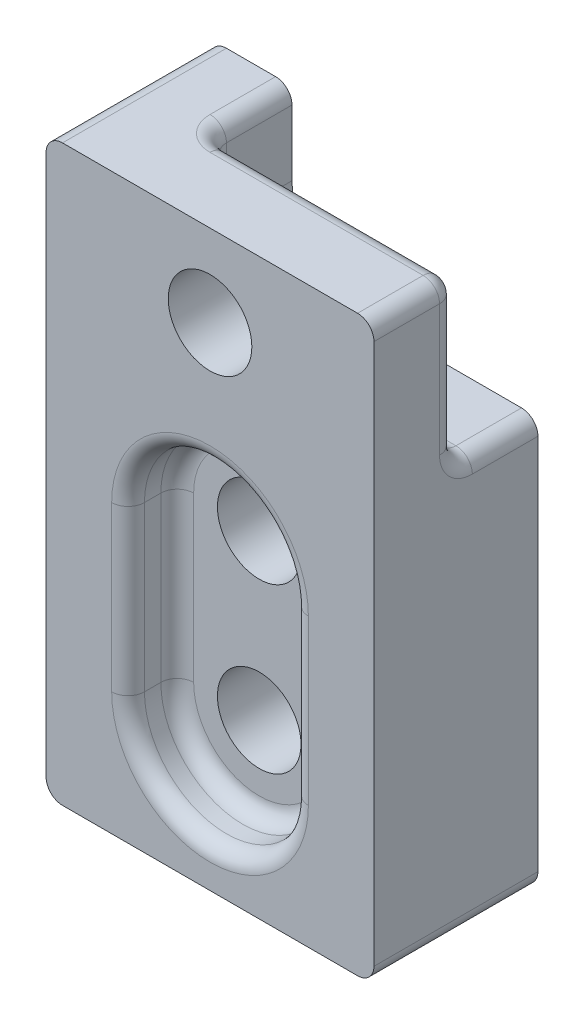
ISO-10303-21;
HEADER;
FILE_DESCRIPTION(('STEP AP214'),'2;1');
FILE_NAME('part.step','',(''),(''),'','','');
FILE_SCHEMA(('AUTOMOTIVE_DESIGN { 1 0 10303 214 1 1 1 1 }'));
ENDSEC;
DATA;
#1=APPLICATION_CONTEXT('core data for automotive mechanical design processes');
#2=APPLICATION_PROTOCOL_DEFINITION('international standard','automotive_design',2000,#1);
#3=PRODUCT_CONTEXT('',#1,'mechanical');
#4=PRODUCT('Part','Part','',(#3));
#5=PRODUCT_RELATED_PRODUCT_CATEGORY('part','',(#4));
#6=PRODUCT_DEFINITION_FORMATION('','',#4);
#7=PRODUCT_DEFINITION_CONTEXT('part definition',#1,'design');
#8=PRODUCT_DEFINITION('design','',#6,#7);
#9=PRODUCT_DEFINITION_SHAPE('','',#8);
#10=(LENGTH_UNIT() NAMED_UNIT(*) SI_UNIT(.MILLI.,.METRE.));
#11=(NAMED_UNIT(*) PLANE_ANGLE_UNIT() SI_UNIT($,.RADIAN.));
#12=(NAMED_UNIT(*) SI_UNIT($,.STERADIAN.) SOLID_ANGLE_UNIT());
#13=UNCERTAINTY_MEASURE_WITH_UNIT(LENGTH_MEASURE(1.E-05),#10,'distance_accuracy_value','');
#14=(GEOMETRIC_REPRESENTATION_CONTEXT(3) GLOBAL_UNCERTAINTY_ASSIGNED_CONTEXT((#13)) GLOBAL_UNIT_ASSIGNED_CONTEXT((#10,
#11,#12)) REPRESENTATION_CONTEXT('',''));
#15=CARTESIAN_POINT('',(0.,0.,0.));
#16=DIRECTION('',(0.,0.,1.));
#17=DIRECTION('',(1.,0.,0.));
#18=AXIS2_PLACEMENT_3D('',#15,#16,#17);
#19=CARTESIAN_POINT('',(0.,0.,10.));
#20=DIRECTION('',(0.,0.,1.));
#21=DIRECTION('',(1.,0.,0.));
#22=AXIS2_PLACEMENT_3D('',#19,#20,#21);
#23=PLANE('',#22);
#24=CARTESIAN_POINT('',(0.,0.,10.));
#25=DIRECTION('',(0.,0.,1.));
#26=DIRECTION('',(1.,0.,0.));
#27=AXIS2_PLACEMENT_3D('',#24,#25,#26);
#28=CIRCLE('',#27,6.);
#29=CARTESIAN_POINT('',(-6.,0.,10.));
#30=VERTEX_POINT('',#29);
#31=CARTESIAN_POINT('',(6.,0.,10.));
#32=VERTEX_POINT('',#31);
#33=EDGE_CURVE('E346',#30,#32,#28,.F.);
#34=ORIENTED_EDGE('',*,*,#33,.T.);
#35=DIRECTION('',(0.,-1.,0.));
#36=VECTOR('',#35,1.);
#37=CARTESIAN_POINT('',(6.,0.,10.));
#38=LINE('',#37,#36);
#39=CARTESIAN_POINT('',(6.,-10.,10.));
#40=VERTEX_POINT('',#39);
#41=EDGE_CURVE('E352',#32,#40,#38,.T.);
#42=ORIENTED_EDGE('',*,*,#41,.T.);
#43=CARTESIAN_POINT('',(0.,-10.,10.));
#44=DIRECTION('',(0.,0.,1.));
#45=DIRECTION('',(1.,0.,0.));
#46=AXIS2_PLACEMENT_3D('',#43,#44,#45);
#47=CIRCLE('',#46,6.);
#48=CARTESIAN_POINT('',(-6.,-10.,10.));
#49=VERTEX_POINT('',#48);
#50=EDGE_CURVE('E350',#40,#49,#47,.F.);
#51=ORIENTED_EDGE('',*,*,#50,.T.);
#52=DIRECTION('',(0.,1.,0.));
#53=VECTOR('',#52,1.);
#54=CARTESIAN_POINT('',(-6.,0.,10.));
#55=LINE('',#54,#53);
#56=EDGE_CURVE('E348',#49,#30,#55,.T.);
#57=ORIENTED_EDGE('',*,*,#56,.T.);
#58=EDGE_LOOP('',(#34,#42,#51,#57));
#59=FACE_BOUND('',#58,.T.);
#60=DIRECTION('',(0.,-1.,0.));
#61=VECTOR('',#60,1.);
#62=CARTESIAN_POINT('',(-10.,-17.5,10.));
#63=LINE('',#62,#61);
#64=CARTESIAN_POINT('',(-10.,16.5,10.));
#65=VERTEX_POINT('',#64);
#66=CARTESIAN_POINT('',(-10.,-16.5,10.));
#67=VERTEX_POINT('',#66);
#68=EDGE_CURVE('E250',#65,#67,#63,.T.);
#69=ORIENTED_EDGE('',*,*,#68,.T.);
#70=CARTESIAN_POINT('',(-9.,-16.5,10.));
#71=DIRECTION('',(0.,0.,1.));
#72=DIRECTION('',(1.,0.,0.));
#73=AXIS2_PLACEMENT_3D('',#70,#71,#72);
#74=CIRCLE('',#73,1.);
#75=CARTESIAN_POINT('',(-9.,-17.5,10.));
#76=VERTEX_POINT('',#75);
#77=EDGE_CURVE('E344',#67,#76,#74,.T.);
#78=ORIENTED_EDGE('',*,*,#77,.T.);
#79=DIRECTION('',(1.,0.,0.));
#80=VECTOR('',#79,1.);
#81=CARTESIAN_POINT('',(-10.,-17.5,10.));
#82=LINE('',#81,#80);
#83=CARTESIAN_POINT('',(9.,-17.5,10.));
#84=VERTEX_POINT('',#83);
#85=EDGE_CURVE('E254',#76,#84,#82,.T.);
#86=ORIENTED_EDGE('',*,*,#85,.T.);
#87=CARTESIAN_POINT('',(9.,-16.5,10.));
#88=DIRECTION('',(0.,0.,1.));
#89=DIRECTION('',(1.,0.,0.));
#90=AXIS2_PLACEMENT_3D('',#87,#88,#89);
#91=CIRCLE('',#90,1.);
#92=CARTESIAN_POINT('',(10.,-16.5,10.));
#93=VERTEX_POINT('',#92);
#94=EDGE_CURVE('E342',#84,#93,#91,.T.);
#95=ORIENTED_EDGE('',*,*,#94,.T.);
#96=DIRECTION('',(0.,1.,0.));
#97=VECTOR('',#96,1.);
#98=CARTESIAN_POINT('',(10.,-17.5,10.));
#99=LINE('',#98,#97);
#100=CARTESIAN_POINT('',(10.,16.5,10.));
#101=VERTEX_POINT('',#100);
#102=EDGE_CURVE('E257',#93,#101,#99,.T.);
#103=ORIENTED_EDGE('',*,*,#102,.T.);
#104=CARTESIAN_POINT('',(9.,16.5,10.));
#105=DIRECTION('',(0.,0.,1.));
#106=DIRECTION('',(1.,0.,0.));
#107=AXIS2_PLACEMENT_3D('',#104,#105,#106);
#108=CIRCLE('',#107,1.);
#109=CARTESIAN_POINT('',(9.,17.5,10.));
#110=VERTEX_POINT('',#109);
#111=EDGE_CURVE('E338',#101,#110,#108,.T.);
#112=ORIENTED_EDGE('',*,*,#111,.T.);
#113=DIRECTION('',(-1.,0.,0.));
#114=VECTOR('',#113,1.);
#115=CARTESIAN_POINT('',(-10.,17.5,10.));
#116=LINE('',#115,#114);
#117=CARTESIAN_POINT('',(-9.,17.5,10.));
#118=VERTEX_POINT('',#117);
#119=EDGE_CURVE('E247',#110,#118,#116,.T.);
#120=ORIENTED_EDGE('',*,*,#119,.T.);
#121=CARTESIAN_POINT('',(-9.,16.5,10.));
#122=DIRECTION('',(0.,0.,1.));
#123=DIRECTION('',(1.,0.,0.));
#124=AXIS2_PLACEMENT_3D('',#121,#122,#123);
#125=CIRCLE('',#124,1.);
#126=EDGE_CURVE('E340',#118,#65,#125,.T.);
#127=ORIENTED_EDGE('',*,*,#126,.T.);
#128=EDGE_LOOP('',(#69,#78,#86,#95,#103,#112,#120,#127));
#129=FACE_BOUND('',#128,.T.);
#130=CARTESIAN_POINT('',(0.,12.5,10.));
#131=DIRECTION('',(0.,0.,1.));
#132=DIRECTION('',(1.,0.,0.));
#133=AXIS2_PLACEMENT_3D('',#130,#131,#132);
#134=CIRCLE('',#133,2.55);
#135=CARTESIAN_POINT('',(2.55,12.5,10.));
#136=VERTEX_POINT('',#135);
#137=EDGE_CURVE('E234',#136,#136,#134,.T.);
#138=ORIENTED_EDGE('',*,*,#137,.F.);
#139=EDGE_LOOP('',(#138));
#140=FACE_BOUND('',#139,.T.);
#141=ADVANCED_FACE('F33',(#59,#129,#140),#23,.T.);
#142=CARTESIAN_POINT('',(0.,0.,10.));
#143=DIRECTION('',(0.,0.,-1.));
#144=DIRECTION('',(-1.,0.,0.));
#145=AXIS2_PLACEMENT_3D('',#142,#143,#144);
#146=CYLINDRICAL_SURFACE('',#145,2.55);
#147=CARTESIAN_POINT('',(0.,0.,0.));
#148=DIRECTION('',(0.,0.,1.));
#149=DIRECTION('',(1.,0.,0.));
#150=AXIS2_PLACEMENT_3D('',#147,#148,#149);
#151=CIRCLE('',#150,2.55);
#152=CARTESIAN_POINT('',(2.55,0.,0.));
#153=VERTEX_POINT('',#152);
#154=EDGE_CURVE('E243',#153,#153,#151,.T.);
#155=ORIENTED_EDGE('',*,*,#154,.F.);
#156=EDGE_LOOP('',(#155));
#157=FACE_BOUND('',#156,.T.);
#158=CARTESIAN_POINT('',(0.,0.,7.));
#159=DIRECTION('',(0.,0.,1.));
#160=DIRECTION('',(1.,0.,0.));
#161=AXIS2_PLACEMENT_3D('',#158,#159,#160);
#162=CIRCLE('',#161,2.55);
#163=CARTESIAN_POINT('',(2.55,0.,7.));
#164=VERTEX_POINT('',#163);
#165=EDGE_CURVE('E274',#164,#164,#162,.T.);
#166=ORIENTED_EDGE('',*,*,#165,.T.);
#167=EDGE_LOOP('',(#166));
#168=FACE_BOUND('',#167,.T.);
#169=ADVANCED_FACE('F467',(#157,#168),#146,.F.);
#170=CARTESIAN_POINT('',(0.,-10.,10.));
#171=DIRECTION('',(0.,0.,-1.));
#172=DIRECTION('',(-1.,0.,0.));
#173=AXIS2_PLACEMENT_3D('',#170,#171,#172);
#174=CYLINDRICAL_SURFACE('',#173,2.55);
#175=CARTESIAN_POINT('',(0.,-10.,0.));
#176=DIRECTION('',(0.,0.,1.));
#177=DIRECTION('',(1.,0.,0.));
#178=AXIS2_PLACEMENT_3D('',#175,#176,#177);
#179=CIRCLE('',#178,2.55);
#180=CARTESIAN_POINT('',(2.55,-10.,0.));
#181=VERTEX_POINT('',#180);
#182=EDGE_CURVE('E216',#181,#181,#179,.T.);
#183=ORIENTED_EDGE('',*,*,#182,.F.);
#184=EDGE_LOOP('',(#183));
#185=FACE_BOUND('',#184,.T.);
#186=CARTESIAN_POINT('',(0.,-10.,7.));
#187=DIRECTION('',(0.,0.,1.));
#188=DIRECTION('',(1.,0.,0.));
#189=AXIS2_PLACEMENT_3D('',#186,#187,#188);
#190=CIRCLE('',#189,2.55);
#191=CARTESIAN_POINT('',(2.55,-10.,7.));
#192=VERTEX_POINT('',#191);
#193=EDGE_CURVE('E271',#192,#192,#190,.T.);
#194=ORIENTED_EDGE('',*,*,#193,.T.);
#195=EDGE_LOOP('',(#194));
#196=FACE_BOUND('',#195,.T.);
#197=ADVANCED_FACE('F473',(#185,#196),#174,.F.);
#198=CARTESIAN_POINT('',(0.,0.,0.));
#199=DIRECTION('',(0.,0.,1.));
#200=DIRECTION('',(1.,0.,0.));
#201=AXIS2_PLACEMENT_3D('',#198,#199,#200);
#202=PLANE('',#201);
#203=ORIENTED_EDGE('',*,*,#182,.T.);
#204=EDGE_LOOP('',(#203));
#205=FACE_BOUND('',#204,.T.);
#206=ORIENTED_EDGE('',*,*,#154,.T.);
#207=EDGE_LOOP('',(#206));
#208=FACE_BOUND('',#207,.T.);
#209=DIRECTION('',(1.,0.,0.));
#210=VECTOR('',#209,1.);
#211=CARTESIAN_POINT('',(0.,7.5,0.));
#212=LINE('',#211,#210);
#213=CARTESIAN_POINT('',(0.,7.5,0.));
#214=VERTEX_POINT('',#213);
#215=CARTESIAN_POINT('',(9.,7.5,0.));
#216=VERTEX_POINT('',#215);
#217=EDGE_CURVE('E221',#214,#216,#212,.T.);
#218=ORIENTED_EDGE('',*,*,#217,.T.);
#219=CARTESIAN_POINT('',(9.,6.5,0.));
#220=DIRECTION('',(0.,0.,1.));
#221=DIRECTION('',(1.,0.,0.));
#222=AXIS2_PLACEMENT_3D('',#219,#220,#221);
#223=CIRCLE('',#222,1.);
#224=CARTESIAN_POINT('',(10.,6.5,0.));
#225=VERTEX_POINT('',#224);
#226=EDGE_CURVE('E286',#216,#225,#223,.F.);
#227=ORIENTED_EDGE('',*,*,#226,.T.);
#228=DIRECTION('',(0.,1.,0.));
#229=VECTOR('',#228,1.);
#230=CARTESIAN_POINT('',(10.,-17.5,0.));
#231=LINE('',#230,#229);
#232=CARTESIAN_POINT('',(10.,-16.5,0.));
#233=VERTEX_POINT('',#232);
#234=EDGE_CURVE('E251',#233,#225,#231,.T.);
#235=ORIENTED_EDGE('',*,*,#234,.F.);
#236=CARTESIAN_POINT('',(9.,-16.5,0.));
#237=DIRECTION('',(0.,0.,1.));
#238=DIRECTION('',(1.,0.,0.));
#239=AXIS2_PLACEMENT_3D('',#236,#237,#238);
#240=CIRCLE('',#239,1.);
#241=CARTESIAN_POINT('',(9.,-17.5,0.));
#242=VERTEX_POINT('',#241);
#243=EDGE_CURVE('E280',#233,#242,#240,.F.);
#244=ORIENTED_EDGE('',*,*,#243,.T.);
#245=DIRECTION('',(1.,0.,0.));
#246=VECTOR('',#245,1.);
#247=CARTESIAN_POINT('',(-10.,-17.5,0.));
#248=LINE('',#247,#246);
#249=CARTESIAN_POINT('',(-9.,-17.5,0.));
#250=VERTEX_POINT('',#249);
#251=EDGE_CURVE('E266',#250,#242,#248,.T.);
#252=ORIENTED_EDGE('',*,*,#251,.F.);
#253=CARTESIAN_POINT('',(-9.,-16.5,0.));
#254=DIRECTION('',(0.,0.,1.));
#255=DIRECTION('',(1.,0.,0.));
#256=AXIS2_PLACEMENT_3D('',#253,#254,#255);
#257=CIRCLE('',#256,1.);
#258=CARTESIAN_POINT('',(-10.,-16.5,0.));
#259=VERTEX_POINT('',#258);
#260=EDGE_CURVE('E282',#250,#259,#257,.F.);
#261=ORIENTED_EDGE('',*,*,#260,.T.);
#262=DIRECTION('',(0.,-1.,0.));
#263=VECTOR('',#262,1.);
#264=CARTESIAN_POINT('',(-10.,-17.5,0.));
#265=LINE('',#264,#263);
#266=CARTESIAN_POINT('',(-10.,16.5,0.));
#267=VERTEX_POINT('',#266);
#268=EDGE_CURVE('E263',#267,#259,#265,.T.);
#269=ORIENTED_EDGE('',*,*,#268,.F.);
#270=CARTESIAN_POINT('',(-9.,16.5,0.));
#271=DIRECTION('',(0.,0.,1.));
#272=DIRECTION('',(1.,0.,0.));
#273=AXIS2_PLACEMENT_3D('',#270,#271,#272);
#274=CIRCLE('',#273,1.);
#275=CARTESIAN_POINT('',(-9.,17.5,0.));
#276=VERTEX_POINT('',#275);
#277=EDGE_CURVE('E278',#267,#276,#274,.F.);
#278=ORIENTED_EDGE('',*,*,#277,.T.);
#279=DIRECTION('',(-1.,0.,0.));
#280=VECTOR('',#279,1.);
#281=CARTESIAN_POINT('',(-10.,17.5,0.));
#282=LINE('',#281,#280);
#283=CARTESIAN_POINT('',(-6.,17.5,0.));
#284=VERTEX_POINT('',#283);
#285=EDGE_CURVE('E246',#284,#276,#282,.T.);
#286=ORIENTED_EDGE('',*,*,#285,.F.);
#287=CARTESIAN_POINT('',(-6.,16.5,0.));
#288=DIRECTION('',(0.,0.,1.));
#289=DIRECTION('',(1.,0.,0.));
#290=AXIS2_PLACEMENT_3D('',#287,#288,#289);
#291=CIRCLE('',#290,1.);
#292=CARTESIAN_POINT('',(-5.,16.5,0.));
#293=VERTEX_POINT('',#292);
#294=EDGE_CURVE('E284',#284,#293,#291,.F.);
#295=ORIENTED_EDGE('',*,*,#294,.T.);
#296=DIRECTION('',(0.,-1.,0.));
#297=VECTOR('',#296,1.);
#298=CARTESIAN_POINT('',(-5.,12.5,0.));
#299=LINE('',#298,#297);
#300=CARTESIAN_POINT('',(-5.,12.5,0.));
#301=VERTEX_POINT('',#300);
#302=EDGE_CURVE('E226',#293,#301,#299,.T.);
#303=ORIENTED_EDGE('',*,*,#302,.T.);
#304=CARTESIAN_POINT('',(0.,12.5,0.));
#305=DIRECTION('',(0.,0.,1.));
#306=DIRECTION('',(1.,0.,0.));
#307=AXIS2_PLACEMENT_3D('',#304,#305,#306);
#308=CIRCLE('',#307,5.);
#309=EDGE_CURVE('E212',#301,#214,#308,.T.);
#310=ORIENTED_EDGE('',*,*,#309,.T.);
#311=EDGE_LOOP('',(#218,#227,#235,#244,#252,#261,#269,#278,#286,#295,#303,#310));
#312=FACE_BOUND('',#311,.T.);
#313=ADVANCED_FACE('F229',(#205,#208,#312),#202,.F.);
#314=CARTESIAN_POINT('',(-10.,17.5,10.));
#315=DIRECTION('',(0.,-1.,0.));
#316=DIRECTION('',(1.,0.,0.));
#317=AXIS2_PLACEMENT_3D('',#314,#315,#316);
#318=PLANE('',#317);
#319=ORIENTED_EDGE('',*,*,#285,.T.);
#320=DIRECTION('',(0.,0.,-1.));
#321=VECTOR('',#320,1.);
#322=CARTESIAN_POINT('',(-9.,17.5,10.));
#323=LINE('',#322,#321);
#324=EDGE_CURVE('E309',#276,#118,#323,.F.);
#325=ORIENTED_EDGE('',*,*,#324,.T.);
#326=ORIENTED_EDGE('',*,*,#119,.F.);
#327=DIRECTION('',(0.,0.,-1.));
#328=VECTOR('',#327,1.);
#329=CARTESIAN_POINT('',(9.,17.5,10.));
#330=LINE('',#329,#328);
#331=CARTESIAN_POINT('',(9.,17.5,6.));
#332=VERTEX_POINT('',#331);
#333=EDGE_CURVE('E300',#110,#332,#330,.T.);
#334=ORIENTED_EDGE('',*,*,#333,.T.);
#335=DIRECTION('',(-1.,0.,0.));
#336=VECTOR('',#335,1.);
#337=CARTESIAN_POINT('',(-10.,17.5,6.));
#338=LINE('',#337,#336);
#339=CARTESIAN_POINT('',(-4.,17.5,6.));
#340=VERTEX_POINT('',#339);
#341=EDGE_CURVE('E302',#332,#340,#338,.T.);
#342=ORIENTED_EDGE('',*,*,#341,.T.);
#343=CARTESIAN_POINT('',(-4.,17.5,4.));
#344=DIRECTION('',(0.,-1.,0.));
#345=DIRECTION('',(1.,0.,0.));
#346=AXIS2_PLACEMENT_3D('',#343,#344,#345);
#347=CIRCLE('',#346,2.);
#348=CARTESIAN_POINT('',(-6.,17.5,4.));
#349=VERTEX_POINT('',#348);
#350=EDGE_CURVE('E304',#349,#340,#347,.F.);
#351=ORIENTED_EDGE('',*,*,#350,.F.);
#352=DIRECTION('',(0.,0.,-1.));
#353=VECTOR('',#352,1.);
#354=CARTESIAN_POINT('',(-6.,17.5,0.));
#355=LINE('',#354,#353);
#356=EDGE_CURVE('E307',#349,#284,#355,.T.);
#357=ORIENTED_EDGE('',*,*,#356,.T.);
#358=EDGE_LOOP('',(#319,#325,#326,#334,#342,#351,#357));
#359=FACE_BOUND('',#358,.T.);
#360=ADVANCED_FACE('F481',(#359),#318,.F.);
#361=CARTESIAN_POINT('',(10.,-17.5,10.));
#362=DIRECTION('',(-1.,0.,0.));
#363=DIRECTION('',(0.,0.,1.));
#364=AXIS2_PLACEMENT_3D('',#361,#362,#363);
#365=PLANE('',#364);
#366=ORIENTED_EDGE('',*,*,#102,.F.);
#367=DIRECTION('',(0.,0.,-1.));
#368=VECTOR('',#367,1.);
#369=CARTESIAN_POINT('',(10.,-16.5,10.));
#370=LINE('',#369,#368);
#371=EDGE_CURVE('E297',#93,#233,#370,.T.);
#372=ORIENTED_EDGE('',*,*,#371,.T.);
#373=ORIENTED_EDGE('',*,*,#234,.T.);
#374=DIRECTION('',(0.,0.,-1.));
#375=VECTOR('',#374,1.);
#376=CARTESIAN_POINT('',(10.,6.5,5.));
#377=LINE('',#376,#375);
#378=CARTESIAN_POINT('',(10.,6.5,4.));
#379=VERTEX_POINT('',#378);
#380=EDGE_CURVE('E295',#225,#379,#377,.F.);
#381=ORIENTED_EDGE('',*,*,#380,.T.);
#382=CARTESIAN_POINT('',(10.,8.5,4.));
#383=DIRECTION('',(-1.,0.,0.));
#384=DIRECTION('',(0.,0.,1.));
#385=AXIS2_PLACEMENT_3D('',#382,#383,#384);
#386=CIRCLE('',#385,2.);
#387=CARTESIAN_POINT('',(10.,8.5,6.));
#388=VERTEX_POINT('',#387);
#389=EDGE_CURVE('E292',#388,#379,#386,.F.);
#390=ORIENTED_EDGE('',*,*,#389,.F.);
#391=DIRECTION('',(0.,1.,0.));
#392=VECTOR('',#391,1.);
#393=CARTESIAN_POINT('',(10.,-17.5,6.));
#394=LINE('',#393,#392);
#395=CARTESIAN_POINT('',(10.,16.5,6.));
#396=VERTEX_POINT('',#395);
#397=EDGE_CURVE('E290',#388,#396,#394,.T.);
#398=ORIENTED_EDGE('',*,*,#397,.T.);
#399=DIRECTION('',(0.,0.,-1.));
#400=VECTOR('',#399,1.);
#401=CARTESIAN_POINT('',(10.,16.5,10.));
#402=LINE('',#401,#400);
#403=EDGE_CURVE('E288',#396,#101,#402,.F.);
#404=ORIENTED_EDGE('',*,*,#403,.T.);
#405=EDGE_LOOP('',(#366,#372,#373,#381,#390,#398,#404));
#406=FACE_BOUND('',#405,.T.);
#407=ADVANCED_FACE('F483',(#406),#365,.F.);
#408=CARTESIAN_POINT('',(-10.,-17.5,10.));
#409=DIRECTION('',(1.,0.,0.));
#410=DIRECTION('',(0.,0.,-1.));
#411=AXIS2_PLACEMENT_3D('',#408,#409,#410);
#412=PLANE('',#411);
#413=ORIENTED_EDGE('',*,*,#268,.T.);
#414=DIRECTION('',(0.,0.,-1.));
#415=VECTOR('',#414,1.);
#416=CARTESIAN_POINT('',(-10.,-16.5,10.));
#417=LINE('',#416,#415);
#418=EDGE_CURVE('E42',#259,#67,#417,.F.);
#419=ORIENTED_EDGE('',*,*,#418,.T.);
#420=ORIENTED_EDGE('',*,*,#68,.F.);
#421=DIRECTION('',(0.,0.,-1.));
#422=VECTOR('',#421,1.);
#423=CARTESIAN_POINT('',(-10.,16.5,10.));
#424=LINE('',#423,#422);
#425=EDGE_CURVE('E373',#65,#267,#424,.T.);
#426=ORIENTED_EDGE('',*,*,#425,.T.);
#427=EDGE_LOOP('',(#413,#419,#420,#426));
#428=FACE_BOUND('',#427,.T.);
#429=ADVANCED_FACE('F486',(#428),#412,.F.);
#430=CARTESIAN_POINT('',(-10.,-17.5,10.));
#431=DIRECTION('',(0.,1.,0.));
#432=DIRECTION('',(0.,0.,1.));
#433=AXIS2_PLACEMENT_3D('',#430,#431,#432);
#434=PLANE('',#433);
#435=ORIENTED_EDGE('',*,*,#85,.F.);
#436=DIRECTION('',(0.,0.,-1.));
#437=VECTOR('',#436,1.);
#438=CARTESIAN_POINT('',(-9.,-17.5,10.));
#439=LINE('',#438,#437);
#440=EDGE_CURVE('E370',#76,#250,#439,.T.);
#441=ORIENTED_EDGE('',*,*,#440,.T.);
#442=ORIENTED_EDGE('',*,*,#251,.T.);
#443=DIRECTION('',(0.,0.,-1.));
#444=VECTOR('',#443,1.);
#445=CARTESIAN_POINT('',(9.,-17.5,10.));
#446=LINE('',#445,#444);
#447=EDGE_CURVE('E368',#242,#84,#446,.F.);
#448=ORIENTED_EDGE('',*,*,#447,.T.);
#449=EDGE_LOOP('',(#435,#441,#442,#448));
#450=FACE_BOUND('',#449,.T.);
#451=ADVANCED_FACE('F488',(#450),#434,.F.);
#452=CARTESIAN_POINT('',(0.,12.5,5.));
#453=DIRECTION('',(0.,0.,-1.));
#454=DIRECTION('',(-1.,0.,0.));
#455=AXIS2_PLACEMENT_3D('',#452,#453,#454);
#456=CYLINDRICAL_SURFACE('',#455,5.);
#457=DIRECTION('',(0.,0.,-1.));
#458=VECTOR('',#457,1.);
#459=CARTESIAN_POINT('',(-5.,12.5,5.));
#460=LINE('',#459,#458);
#461=CARTESIAN_POINT('',(-5.,12.5,4.));
#462=VERTEX_POINT('',#461);
#463=EDGE_CURVE('E217',#462,#301,#460,.T.);
#464=ORIENTED_EDGE('',*,*,#463,.F.);
#465=CARTESIAN_POINT('',(0.,12.5,4.));
#466=DIRECTION('',(0.,0.,1.));
#467=DIRECTION('',(1.,0.,0.));
#468=AXIS2_PLACEMENT_3D('',#465,#466,#467);
#469=CIRCLE('',#468,5.);
#470=CARTESIAN_POINT('',(0.,7.5,4.));
#471=VERTEX_POINT('',#470);
#472=EDGE_CURVE('E11',#462,#471,#469,.T.);
#473=ORIENTED_EDGE('',*,*,#472,.T.);
#474=DIRECTION('',(0.,0.,-1.));
#475=VECTOR('',#474,1.);
#476=CARTESIAN_POINT('',(0.,7.5,5.));
#477=LINE('',#476,#475);
#478=EDGE_CURVE('E207',#471,#214,#477,.T.);
#479=ORIENTED_EDGE('',*,*,#478,.T.);
#480=ORIENTED_EDGE('',*,*,#309,.F.);
#481=EDGE_LOOP('',(#464,#473,#479,#480));
#482=FACE_BOUND('',#481,.T.);
#483=ADVANCED_FACE('F210',(#482),#456,.F.);
#484=CARTESIAN_POINT('',(0.,7.5,5.));
#485=DIRECTION('',(0.,1.,0.));
#486=DIRECTION('',(-1.,0.,0.));
#487=AXIS2_PLACEMENT_3D('',#484,#485,#486);
#488=PLANE('',#487);
#489=DIRECTION('',(1.,0.,0.));
#490=VECTOR('',#489,1.);
#491=CARTESIAN_POINT('',(0.,7.5,4.));
#492=LINE('',#491,#490);
#493=CARTESIAN_POINT('',(9.,7.5,4.));
#494=VERTEX_POINT('',#493);
#495=EDGE_CURVE('E260',#471,#494,#492,.T.);
#496=ORIENTED_EDGE('',*,*,#495,.T.);
#497=DIRECTION('',(0.,0.,-1.));
#498=VECTOR('',#497,1.);
#499=CARTESIAN_POINT('',(9.,7.5,0.));
#500=LINE('',#499,#498);
#501=EDGE_CURVE('E224',#494,#216,#500,.T.);
#502=ORIENTED_EDGE('',*,*,#501,.T.);
#503=ORIENTED_EDGE('',*,*,#217,.F.);
#504=ORIENTED_EDGE('',*,*,#478,.F.);
#505=EDGE_LOOP('',(#496,#502,#503,#504));
#506=FACE_BOUND('',#505,.T.);
#507=ADVANCED_FACE('F222',(#506),#488,.T.);
#508=CARTESIAN_POINT('',(-5.,12.5,5.));
#509=DIRECTION('',(1.,0.,0.));
#510=DIRECTION('',(0.,1.,0.));
#511=AXIS2_PLACEMENT_3D('',#508,#509,#510);
#512=PLANE('',#511);
#513=ORIENTED_EDGE('',*,*,#302,.F.);
#514=DIRECTION('',(0.,0.,-1.));
#515=VECTOR('',#514,1.);
#516=CARTESIAN_POINT('',(-5.,16.5,5.));
#517=LINE('',#516,#515);
#518=CARTESIAN_POINT('',(-5.,16.5,4.));
#519=VERTEX_POINT('',#518);
#520=EDGE_CURVE('E313',#293,#519,#517,.F.);
#521=ORIENTED_EDGE('',*,*,#520,.T.);
#522=DIRECTION('',(0.,-1.,0.));
#523=VECTOR('',#522,1.);
#524=CARTESIAN_POINT('',(-5.,12.5,4.));
#525=LINE('',#524,#523);
#526=EDGE_CURVE('E311',#519,#462,#525,.T.);
#527=ORIENTED_EDGE('',*,*,#526,.T.);
#528=ORIENTED_EDGE('',*,*,#463,.T.);
#529=EDGE_LOOP('',(#513,#521,#527,#528));
#530=FACE_BOUND('',#529,.T.);
#531=ADVANCED_FACE('F619',(#530),#512,.T.);
#532=CARTESIAN_POINT('',(0.,12.5,5.));
#533=DIRECTION('',(0.,0.,1.));
#534=DIRECTION('',(1.,0.,0.));
#535=AXIS2_PLACEMENT_3D('',#532,#533,#534);
#536=PLANE('',#535);
#537=DIRECTION('',(-1.,0.,0.));
#538=VECTOR('',#537,1.);
#539=CARTESIAN_POINT('',(0.,16.5,5.));
#540=LINE('',#539,#538);
#541=CARTESIAN_POINT('',(-4.,16.5,5.));
#542=VERTEX_POINT('',#541);
#543=CARTESIAN_POINT('',(9.,16.5,5.));
#544=VERTEX_POINT('',#543);
#545=EDGE_CURVE('E50',#542,#544,#540,.F.);
#546=ORIENTED_EDGE('',*,*,#545,.T.);
#547=DIRECTION('',(0.,1.,0.));
#548=VECTOR('',#547,1.);
#549=CARTESIAN_POINT('',(9.,12.5,5.));
#550=LINE('',#549,#548);
#551=CARTESIAN_POINT('',(9.,8.5,5.));
#552=VERTEX_POINT('',#551);
#553=EDGE_CURVE('E362',#544,#552,#550,.F.);
#554=ORIENTED_EDGE('',*,*,#553,.T.);
#555=DIRECTION('',(1.,0.,0.));
#556=VECTOR('',#555,1.);
#557=CARTESIAN_POINT('',(0.,8.5,5.));
#558=LINE('',#557,#556);
#559=CARTESIAN_POINT('',(0.,8.5,5.));
#560=VERTEX_POINT('',#559);
#561=EDGE_CURVE('E359',#552,#560,#558,.F.);
#562=ORIENTED_EDGE('',*,*,#561,.T.);
#563=CARTESIAN_POINT('',(0.,12.5,5.));
#564=DIRECTION('',(0.,0.,1.));
#565=DIRECTION('',(1.,0.,0.));
#566=AXIS2_PLACEMENT_3D('',#563,#564,#565);
#567=CIRCLE('',#566,4.);
#568=CARTESIAN_POINT('',(-4.,12.5,5.));
#569=VERTEX_POINT('',#568);
#570=EDGE_CURVE('E357',#560,#569,#567,.F.);
#571=ORIENTED_EDGE('',*,*,#570,.T.);
#572=DIRECTION('',(0.,-1.,0.));
#573=VECTOR('',#572,1.);
#574=CARTESIAN_POINT('',(-4.,12.5,5.));
#575=LINE('',#574,#573);
#576=EDGE_CURVE('E355',#569,#542,#575,.F.);
#577=ORIENTED_EDGE('',*,*,#576,.T.);
#578=EDGE_LOOP('',(#546,#554,#562,#571,#577));
#579=FACE_BOUND('',#578,.T.);
#580=CARTESIAN_POINT('',(0.,12.5,5.));
#581=DIRECTION('',(0.,0.,1.));
#582=DIRECTION('',(1.,0.,0.));
#583=AXIS2_PLACEMENT_3D('',#580,#581,#582);
#584=CIRCLE('',#583,2.55);
#585=CARTESIAN_POINT('',(2.55,12.5,5.));
#586=VERTEX_POINT('',#585);
#587=EDGE_CURVE('E231',#586,#586,#584,.F.);
#588=ORIENTED_EDGE('',*,*,#587,.F.);
#589=EDGE_LOOP('',(#588));
#590=FACE_BOUND('',#589,.T.);
#591=ADVANCED_FACE('F593',(#579,#590),#536,.F.);
#592=CARTESIAN_POINT('',(0.,12.5,10.));
#593=DIRECTION('',(0.,0.,-1.));
#594=DIRECTION('',(-1.,0.,0.));
#595=AXIS2_PLACEMENT_3D('',#592,#593,#594);
#596=CYLINDRICAL_SURFACE('',#595,2.55);
#597=ORIENTED_EDGE('',*,*,#137,.T.);
#598=EDGE_LOOP('',(#597));
#599=FACE_BOUND('',#598,.T.);
#600=ORIENTED_EDGE('',*,*,#587,.T.);
#601=EDGE_LOOP('',(#600));
#602=FACE_BOUND('',#601,.T.);
#603=ADVANCED_FACE('F463',(#599,#602),#596,.F.);
#604=CARTESIAN_POINT('',(-5.,0.,7.));
#605=DIRECTION('',(1.,0.,0.));
#606=DIRECTION('',(0.,1.,0.));
#607=AXIS2_PLACEMENT_3D('',#604,#605,#606);
#608=PLANE('',#607);
#609=DIRECTION('',(0.,0.,1.));
#610=VECTOR('',#609,1.);
#611=CARTESIAN_POINT('',(-5.,-10.,7.));
#612=LINE('',#611,#610);
#613=CARTESIAN_POINT('',(-5.,-10.,8.));
#614=VERTEX_POINT('',#613);
#615=CARTESIAN_POINT('',(-5.,-10.,9.));
#616=VERTEX_POINT('',#615);
#617=EDGE_CURVE('E408',#614,#616,#612,.T.);
#618=ORIENTED_EDGE('',*,*,#617,.F.);
#619=DIRECTION('',(0.,1.,0.));
#620=VECTOR('',#619,1.);
#621=CARTESIAN_POINT('',(-5.,0.,8.));
#622=LINE('',#621,#620);
#623=CARTESIAN_POINT('',(-5.,0.,8.));
#624=VERTEX_POINT('',#623);
#625=EDGE_CURVE('E336',#614,#624,#622,.T.);
#626=ORIENTED_EDGE('',*,*,#625,.T.);
#627=DIRECTION('',(0.,0.,1.));
#628=VECTOR('',#627,1.);
#629=CARTESIAN_POINT('',(-5.,0.,7.));
#630=LINE('',#629,#628);
#631=CARTESIAN_POINT('',(-5.,0.,9.));
#632=VERTEX_POINT('',#631);
#633=EDGE_CURVE('E275',#624,#632,#630,.T.);
#634=ORIENTED_EDGE('',*,*,#633,.T.);
#635=DIRECTION('',(0.,1.,0.));
#636=VECTOR('',#635,1.);
#637=CARTESIAN_POINT('',(-5.,0.,9.));
#638=LINE('',#637,#636);
#639=EDGE_CURVE('E334',#632,#616,#638,.F.);
#640=ORIENTED_EDGE('',*,*,#639,.T.);
#641=EDGE_LOOP('',(#618,#626,#634,#640));
#642=FACE_BOUND('',#641,.T.);
#643=ADVANCED_FACE('F442',(#642),#608,.T.);
#644=CARTESIAN_POINT('',(0.,0.,7.));
#645=DIRECTION('',(0.,0.,1.));
#646=DIRECTION('',(1.,0.,0.));
#647=AXIS2_PLACEMENT_3D('',#644,#645,#646);
#648=CYLINDRICAL_SURFACE('',#647,5.);
#649=ORIENTED_EDGE('',*,*,#633,.F.);
#650=CARTESIAN_POINT('',(0.,0.,8.));
#651=DIRECTION('',(0.,0.,1.));
#652=DIRECTION('',(1.,0.,0.));
#653=AXIS2_PLACEMENT_3D('',#650,#651,#652);
#654=CIRCLE('',#653,5.);
#655=CARTESIAN_POINT('',(5.,0.,8.));
#656=VERTEX_POINT('',#655);
#657=EDGE_CURVE('E366',#624,#656,#654,.F.);
#658=ORIENTED_EDGE('',*,*,#657,.T.);
#659=DIRECTION('',(0.,0.,1.));
#660=VECTOR('',#659,1.);
#661=CARTESIAN_POINT('',(5.,0.,7.));
#662=LINE('',#661,#660);
#663=CARTESIAN_POINT('',(5.,0.,9.));
#664=VERTEX_POINT('',#663);
#665=EDGE_CURVE('E452',#656,#664,#662,.T.);
#666=ORIENTED_EDGE('',*,*,#665,.T.);
#667=CARTESIAN_POINT('',(0.,0.,9.));
#668=DIRECTION('',(0.,0.,1.));
#669=DIRECTION('',(1.,0.,0.));
#670=AXIS2_PLACEMENT_3D('',#667,#668,#669);
#671=CIRCLE('',#670,5.);
#672=EDGE_CURVE('E364',#664,#632,#671,.T.);
#673=ORIENTED_EDGE('',*,*,#672,.T.);
#674=EDGE_LOOP('',(#649,#658,#666,#673));
#675=FACE_BOUND('',#674,.T.);
#676=ADVANCED_FACE('F651',(#675),#648,.F.);
#677=CARTESIAN_POINT('',(5.,0.,7.));
#678=DIRECTION('',(-1.,0.,0.));
#679=DIRECTION('',(0.,-1.,0.));
#680=AXIS2_PLACEMENT_3D('',#677,#678,#679);
#681=PLANE('',#680);
#682=ORIENTED_EDGE('',*,*,#665,.F.);
#683=DIRECTION('',(0.,-1.,0.));
#684=VECTOR('',#683,1.);
#685=CARTESIAN_POINT('',(5.,-10.,8.));
#686=LINE('',#685,#684);
#687=CARTESIAN_POINT('',(5.,-10.,8.));
#688=VERTEX_POINT('',#687);
#689=EDGE_CURVE('E318',#656,#688,#686,.T.);
#690=ORIENTED_EDGE('',*,*,#689,.T.);
#691=DIRECTION('',(0.,0.,1.));
#692=VECTOR('',#691,1.);
#693=CARTESIAN_POINT('',(5.,-10.,7.));
#694=LINE('',#693,#692);
#695=CARTESIAN_POINT('',(5.,-10.,9.));
#696=VERTEX_POINT('',#695);
#697=EDGE_CURVE('E450',#688,#696,#694,.T.);
#698=ORIENTED_EDGE('',*,*,#697,.T.);
#699=DIRECTION('',(0.,-1.,0.));
#700=VECTOR('',#699,1.);
#701=CARTESIAN_POINT('',(5.,0.,9.));
#702=LINE('',#701,#700);
#703=EDGE_CURVE('E315',#696,#664,#702,.F.);
#704=ORIENTED_EDGE('',*,*,#703,.T.);
#705=EDGE_LOOP('',(#682,#690,#698,#704));
#706=FACE_BOUND('',#705,.T.);
#707=ADVANCED_FACE('F645',(#706),#681,.T.);
#708=CARTESIAN_POINT('',(0.,-10.,7.));
#709=DIRECTION('',(0.,0.,1.));
#710=DIRECTION('',(1.,0.,0.));
#711=AXIS2_PLACEMENT_3D('',#708,#709,#710);
#712=CYLINDRICAL_SURFACE('',#711,5.);
#713=ORIENTED_EDGE('',*,*,#697,.F.);
#714=CARTESIAN_POINT('',(0.,-10.,8.));
#715=DIRECTION('',(0.,0.,1.));
#716=DIRECTION('',(1.,0.,0.));
#717=AXIS2_PLACEMENT_3D('',#714,#715,#716);
#718=CIRCLE('',#717,5.);
#719=EDGE_CURVE('E332',#688,#614,#718,.F.);
#720=ORIENTED_EDGE('',*,*,#719,.T.);
#721=ORIENTED_EDGE('',*,*,#617,.T.);
#722=CARTESIAN_POINT('',(0.,-10.,9.));
#723=DIRECTION('',(0.,0.,1.));
#724=DIRECTION('',(1.,0.,0.));
#725=AXIS2_PLACEMENT_3D('',#722,#723,#724);
#726=CIRCLE('',#725,5.);
#727=EDGE_CURVE('E330',#616,#696,#726,.T.);
#728=ORIENTED_EDGE('',*,*,#727,.T.);
#729=EDGE_LOOP('',(#713,#720,#721,#728));
#730=FACE_BOUND('',#729,.T.);
#731=ADVANCED_FACE('F447',(#730),#712,.F.);
#732=CARTESIAN_POINT('',(0.,0.,7.));
#733=DIRECTION('',(0.,0.,1.));
#734=DIRECTION('',(1.,0.,0.));
#735=AXIS2_PLACEMENT_3D('',#732,#733,#734);
#736=PLANE('',#735);
#737=CARTESIAN_POINT('',(0.,-10.,7.));
#738=DIRECTION('',(0.,0.,1.));
#739=DIRECTION('',(1.,0.,0.));
#740=AXIS2_PLACEMENT_3D('',#737,#738,#739);
#741=CIRCLE('',#740,4.);
#742=CARTESIAN_POINT('',(-4.,-10.,7.));
#743=VERTEX_POINT('',#742);
#744=CARTESIAN_POINT('',(4.,-10.,7.));
#745=VERTEX_POINT('',#744);
#746=EDGE_CURVE('E325',#743,#745,#741,.T.);
#747=ORIENTED_EDGE('',*,*,#746,.T.);
#748=DIRECTION('',(0.,-1.,0.));
#749=VECTOR('',#748,1.);
#750=CARTESIAN_POINT('',(4.,0.,7.));
#751=LINE('',#750,#749);
#752=CARTESIAN_POINT('',(4.,0.,7.));
#753=VERTEX_POINT('',#752);
#754=EDGE_CURVE('E327',#745,#753,#751,.F.);
#755=ORIENTED_EDGE('',*,*,#754,.T.);
#756=CARTESIAN_POINT('',(0.,0.,7.));
#757=DIRECTION('',(0.,0.,1.));
#758=DIRECTION('',(1.,0.,0.));
#759=AXIS2_PLACEMENT_3D('',#756,#757,#758);
#760=CIRCLE('',#759,4.);
#761=CARTESIAN_POINT('',(-4.,0.,7.));
#762=VERTEX_POINT('',#761);
#763=EDGE_CURVE('E321',#753,#762,#760,.T.);
#764=ORIENTED_EDGE('',*,*,#763,.T.);
#765=DIRECTION('',(0.,1.,0.));
#766=VECTOR('',#765,1.);
#767=CARTESIAN_POINT('',(-4.,-10.,7.));
#768=LINE('',#767,#766);
#769=EDGE_CURVE('E323',#762,#743,#768,.F.);
#770=ORIENTED_EDGE('',*,*,#769,.T.);
#771=EDGE_LOOP('',(#747,#755,#764,#770));
#772=FACE_BOUND('',#771,.T.);
#773=ORIENTED_EDGE('',*,*,#165,.F.);
#774=EDGE_LOOP('',(#773));
#775=FACE_BOUND('',#774,.T.);
#776=ORIENTED_EDGE('',*,*,#193,.F.);
#777=EDGE_LOOP('',(#776));
#778=FACE_BOUND('',#777,.T.);
#779=ADVANCED_FACE('F541',(#772,#775,#778),#736,.T.);
#780=CARTESIAN_POINT('',(-6.,16.5,10.));
#781=DIRECTION('',(0.,0.,1.));
#782=DIRECTION('',(1.,0.,0.));
#783=AXIS2_PLACEMENT_3D('',#780,#781,#782);
#784=CYLINDRICAL_SURFACE('',#783,1.);
#785=ORIENTED_EDGE('',*,*,#294,.F.);
#786=ORIENTED_EDGE('',*,*,#356,.F.);
#787=CARTESIAN_POINT('',(-6.,16.5,4.));
#788=DIRECTION('',(0.,0.,1.));
#789=DIRECTION('',(1.,0.,0.));
#790=AXIS2_PLACEMENT_3D('',#787,#788,#789);
#791=CIRCLE('',#790,1.);
#792=EDGE_CURVE('E405',#519,#349,#791,.T.);
#793=ORIENTED_EDGE('',*,*,#792,.F.);
#794=ORIENTED_EDGE('',*,*,#520,.F.);
#795=EDGE_LOOP('',(#785,#786,#793,#794));
#796=FACE_BOUND('',#795,.T.);
#797=ADVANCED_FACE('F537',(#796),#784,.T.);
#798=CARTESIAN_POINT('',(-4.,16.5,4.));
#799=DIRECTION('',(0.,-1.,0.));
#800=DIRECTION('',(1.,0.,0.));
#801=AXIS2_PLACEMENT_3D('',#798,#799,#800);
#802=TOROIDAL_SURFACE('',#801,2.,1.);
#803=ORIENTED_EDGE('',*,*,#792,.T.);
#804=ORIENTED_EDGE('',*,*,#350,.T.);
#805=CARTESIAN_POINT('',(-4.,16.5,6.));
#806=DIRECTION('',(-1.,0.,0.));
#807=DIRECTION('',(0.,0.,1.));
#808=AXIS2_PLACEMENT_3D('',#805,#806,#807);
#809=CIRCLE('',#808,1.);
#810=EDGE_CURVE('E402',#542,#340,#809,.F.);
#811=ORIENTED_EDGE('',*,*,#810,.F.);
#812=CARTESIAN_POINT('',(-4.,16.5,4.));
#813=DIRECTION('',(0.,-1.,0.));
#814=DIRECTION('',(1.,0.,0.));
#815=AXIS2_PLACEMENT_3D('',#812,#813,#814);
#816=CIRCLE('',#815,1.);
#817=EDGE_CURVE('E399',#519,#542,#816,.F.);
#818=ORIENTED_EDGE('',*,*,#817,.F.);
#819=EDGE_LOOP('',(#803,#804,#811,#818));
#820=FACE_BOUND('',#819,.T.);
#821=ADVANCED_FACE('F533',(#820),#802,.T.);
#822=CARTESIAN_POINT('',(9.,16.5,10.));
#823=DIRECTION('',(0.,0.,-1.));
#824=DIRECTION('',(-1.,0.,0.));
#825=AXIS2_PLACEMENT_3D('',#822,#823,#824);
#826=CYLINDRICAL_SURFACE('',#825,1.);
#827=ORIENTED_EDGE('',*,*,#111,.F.);
#828=ORIENTED_EDGE('',*,*,#403,.F.);
#829=CARTESIAN_POINT('',(9.,16.5,6.));
#830=DIRECTION('',(0.,0.,-1.));
#831=DIRECTION('',(-1.,0.,0.));
#832=AXIS2_PLACEMENT_3D('',#829,#830,#831);
#833=CIRCLE('',#832,1.);
#834=EDGE_CURVE('E396',#332,#396,#833,.T.);
#835=ORIENTED_EDGE('',*,*,#834,.F.);
#836=ORIENTED_EDGE('',*,*,#333,.F.);
#837=EDGE_LOOP('',(#827,#828,#835,#836));
#838=FACE_BOUND('',#837,.T.);
#839=ADVANCED_FACE('F529',(#838),#826,.T.);
#840=CARTESIAN_POINT('',(-10.,16.5,6.));
#841=DIRECTION('',(-1.,0.,0.));
#842=DIRECTION('',(0.,-1.,0.));
#843=AXIS2_PLACEMENT_3D('',#840,#841,#842);
#844=CYLINDRICAL_SURFACE('',#843,1.);
#845=ORIENTED_EDGE('',*,*,#810,.T.);
#846=ORIENTED_EDGE('',*,*,#341,.F.);
#847=CARTESIAN_POINT('',(9.,16.5,6.));
#848=DIRECTION('',(1.,0.,0.));
#849=DIRECTION('',(0.,1.,0.));
#850=AXIS2_PLACEMENT_3D('',#847,#848,#849);
#851=CIRCLE('',#850,1.);
#852=EDGE_CURVE('E393',#544,#332,#851,.T.);
#853=ORIENTED_EDGE('',*,*,#852,.F.);
#854=ORIENTED_EDGE('',*,*,#545,.F.);
#855=EDGE_LOOP('',(#845,#846,#853,#854));
#856=FACE_BOUND('',#855,.T.);
#857=ADVANCED_FACE('F525',(#856),#844,.T.);
#858=CARTESIAN_POINT('',(-4.,12.5,4.));
#859=DIRECTION('',(0.,-1.,0.));
#860=DIRECTION('',(1.,0.,0.));
#861=AXIS2_PLACEMENT_3D('',#858,#859,#860);
#862=CYLINDRICAL_SURFACE('',#861,1.);
#863=ORIENTED_EDGE('',*,*,#817,.T.);
#864=ORIENTED_EDGE('',*,*,#576,.F.);
#865=CARTESIAN_POINT('',(-4.,12.5,4.));
#866=DIRECTION('',(0.,1.,0.));
#867=DIRECTION('',(0.,0.,1.));
#868=AXIS2_PLACEMENT_3D('',#865,#866,#867);
#869=CIRCLE('',#868,1.);
#870=EDGE_CURVE('E390',#462,#569,#869,.T.);
#871=ORIENTED_EDGE('',*,*,#870,.F.);
#872=ORIENTED_EDGE('',*,*,#526,.F.);
#873=EDGE_LOOP('',(#863,#864,#871,#872));
#874=FACE_BOUND('',#873,.T.);
#875=ADVANCED_FACE('F521',(#874),#862,.F.);
#876=CARTESIAN_POINT('',(9.,16.5,6.));
#877=DIRECTION('',(0.,0.,1.));
#878=DIRECTION('',(1.,0.,0.));
#879=AXIS2_PLACEMENT_3D('',#876,#877,#878);
#880=SPHERICAL_SURFACE('',#879,1.);
#881=ORIENTED_EDGE('',*,*,#852,.T.);
#882=ORIENTED_EDGE('',*,*,#834,.T.);
#883=CARTESIAN_POINT('',(9.,16.5,6.));
#884=DIRECTION('',(0.,1.,0.));
#885=DIRECTION('',(0.,0.,1.));
#886=AXIS2_PLACEMENT_3D('',#883,#884,#885);
#887=CIRCLE('',#886,1.);
#888=EDGE_CURVE('E387',#544,#396,#887,.F.);
#889=ORIENTED_EDGE('',*,*,#888,.F.);
#890=EDGE_LOOP('',(#881,#882,#889));
#891=FACE_BOUND('',#890,.T.);
#892=ADVANCED_FACE('F517',(#891),#880,.T.);
#893=CARTESIAN_POINT('',(0.,12.5,4.));
#894=DIRECTION('',(0.,0.,1.));
#895=DIRECTION('',(1.,0.,0.));
#896=AXIS2_PLACEMENT_3D('',#893,#894,#895);
#897=TOROIDAL_SURFACE('',#896,4.,1.);
#898=ORIENTED_EDGE('',*,*,#870,.T.);
#899=ORIENTED_EDGE('',*,*,#570,.F.);
#900=CARTESIAN_POINT('',(0.,8.5,4.));
#901=DIRECTION('',(-1.,0.,0.));
#902=DIRECTION('',(0.,0.,1.));
#903=AXIS2_PLACEMENT_3D('',#900,#901,#902);
#904=CIRCLE('',#903,1.);
#905=EDGE_CURVE('E384',#471,#560,#904,.T.);
#906=ORIENTED_EDGE('',*,*,#905,.F.);
#907=ORIENTED_EDGE('',*,*,#472,.F.);
#908=EDGE_LOOP('',(#898,#899,#906,#907));
#909=FACE_BOUND('',#908,.T.);
#910=ADVANCED_FACE('F513',(#909),#897,.F.);
#911=CARTESIAN_POINT('',(9.,-17.5,6.));
#912=DIRECTION('',(0.,1.,0.));
#913=DIRECTION('',(0.,0.,1.));
#914=AXIS2_PLACEMENT_3D('',#911,#912,#913);
#915=CYLINDRICAL_SURFACE('',#914,1.);
#916=ORIENTED_EDGE('',*,*,#888,.T.);
#917=ORIENTED_EDGE('',*,*,#397,.F.);
#918=CARTESIAN_POINT('',(9.,8.5,6.));
#919=DIRECTION('',(0.,-1.,0.));
#920=DIRECTION('',(0.,0.,-1.));
#921=AXIS2_PLACEMENT_3D('',#918,#919,#920);
#922=CIRCLE('',#921,1.);
#923=EDGE_CURVE('E382',#552,#388,#922,.T.);
#924=ORIENTED_EDGE('',*,*,#923,.F.);
#925=ORIENTED_EDGE('',*,*,#553,.F.);
#926=EDGE_LOOP('',(#916,#917,#924,#925));
#927=FACE_BOUND('',#926,.T.);
#928=ADVANCED_FACE('F509',(#927),#915,.T.);
#929=CARTESIAN_POINT('',(0.,8.5,4.));
#930=DIRECTION('',(1.,0.,0.));
#931=DIRECTION('',(0.,1.,0.));
#932=AXIS2_PLACEMENT_3D('',#929,#930,#931);
#933=CYLINDRICAL_SURFACE('',#932,1.);
#934=ORIENTED_EDGE('',*,*,#905,.T.);
#935=ORIENTED_EDGE('',*,*,#561,.F.);
#936=CARTESIAN_POINT('',(9.,8.5,4.));
#937=DIRECTION('',(-1.,0.,0.));
#938=DIRECTION('',(0.,0.,1.));
#939=AXIS2_PLACEMENT_3D('',#936,#937,#938);
#940=CIRCLE('',#939,1.);
#941=EDGE_CURVE('E58',#494,#552,#940,.T.);
#942=ORIENTED_EDGE('',*,*,#941,.F.);
#943=ORIENTED_EDGE('',*,*,#495,.F.);
#944=EDGE_LOOP('',(#934,#935,#942,#943));
#945=FACE_BOUND('',#944,.T.);
#946=ADVANCED_FACE('F506',(#945),#933,.F.);
#947=CARTESIAN_POINT('',(9.,8.5,4.));
#948=DIRECTION('',(-1.,0.,0.));
#949=DIRECTION('',(0.,0.,1.));
#950=AXIS2_PLACEMENT_3D('',#947,#948,#949);
#951=TOROIDAL_SURFACE('',#950,2.,1.);
#952=ORIENTED_EDGE('',*,*,#923,.T.);
#953=ORIENTED_EDGE('',*,*,#389,.T.);
#954=CARTESIAN_POINT('',(9.,6.5,4.));
#955=DIRECTION('',(0.,0.,1.));
#956=DIRECTION('',(1.,0.,0.));
#957=AXIS2_PLACEMENT_3D('',#954,#955,#956);
#958=CIRCLE('',#957,1.);
#959=EDGE_CURVE('E377',#494,#379,#958,.F.);
#960=ORIENTED_EDGE('',*,*,#959,.F.);
#961=ORIENTED_EDGE('',*,*,#941,.T.);
#962=EDGE_LOOP('',(#952,#953,#960,#961));
#963=FACE_BOUND('',#962,.T.);
#964=ADVANCED_FACE('F502',(#963),#951,.T.);
#965=CARTESIAN_POINT('',(9.,6.5,5.));
#966=DIRECTION('',(0.,0.,1.));
#967=DIRECTION('',(1.,0.,0.));
#968=AXIS2_PLACEMENT_3D('',#965,#966,#967);
#969=CYLINDRICAL_SURFACE('',#968,1.);
#970=ORIENTED_EDGE('',*,*,#959,.T.);
#971=ORIENTED_EDGE('',*,*,#380,.F.);
#972=ORIENTED_EDGE('',*,*,#226,.F.);
#973=ORIENTED_EDGE('',*,*,#501,.F.);
#974=EDGE_LOOP('',(#970,#971,#972,#973));
#975=FACE_BOUND('',#974,.T.);
#976=ADVANCED_FACE('F498',(#975),#969,.T.);
#977=CARTESIAN_POINT('',(-4.,0.,8.));
#978=DIRECTION('',(0.,-1.,0.));
#979=DIRECTION('',(1.,0.,0.));
#980=AXIS2_PLACEMENT_3D('',#977,#978,#979);
#981=CYLINDRICAL_SURFACE('',#980,1.);
#982=CARTESIAN_POINT('',(-4.,-10.,8.));
#983=DIRECTION('',(0.,1.,0.));
#984=DIRECTION('',(0.,0.,1.));
#985=AXIS2_PLACEMENT_3D('',#982,#983,#984);
#986=CIRCLE('',#985,1.);
#987=EDGE_CURVE('E413',#743,#614,#986,.T.);
#988=ORIENTED_EDGE('',*,*,#987,.F.);
#989=ORIENTED_EDGE('',*,*,#769,.F.);
#990=CARTESIAN_POINT('',(-4.,0.,8.));
#991=DIRECTION('',(0.,-1.,0.));
#992=DIRECTION('',(1.,0.,0.));
#993=AXIS2_PLACEMENT_3D('',#990,#991,#992);
#994=CIRCLE('',#993,1.);
#995=EDGE_CURVE('E380',#624,#762,#994,.T.);
#996=ORIENTED_EDGE('',*,*,#995,.F.);
#997=ORIENTED_EDGE('',*,*,#625,.F.);
#998=EDGE_LOOP('',(#988,#989,#996,#997));
#999=FACE_BOUND('',#998,.T.);
#1000=ADVANCED_FACE('F501',(#999),#981,.F.);
#1001=CARTESIAN_POINT('',(0.,0.,8.));
#1002=DIRECTION('',(0.,0.,1.));
#1003=DIRECTION('',(1.,0.,0.));
#1004=AXIS2_PLACEMENT_3D('',#1001,#1002,#1003);
#1005=TOROIDAL_SURFACE('',#1004,4.,1.);
#1006=ORIENTED_EDGE('',*,*,#995,.T.);
#1007=ORIENTED_EDGE('',*,*,#763,.F.);
#1008=CARTESIAN_POINT('',(4.,0.,8.));
#1009=DIRECTION('',(0.,1.,0.));
#1010=DIRECTION('',(0.,0.,1.));
#1011=AXIS2_PLACEMENT_3D('',#1008,#1009,#1010);
#1012=CIRCLE('',#1011,1.);
#1013=EDGE_CURVE('E411',#656,#753,#1012,.T.);
#1014=ORIENTED_EDGE('',*,*,#1013,.F.);
#1015=ORIENTED_EDGE('',*,*,#657,.F.);
#1016=EDGE_LOOP('',(#1006,#1007,#1014,#1015));
#1017=FACE_BOUND('',#1016,.T.);
#1018=ADVANCED_FACE('F550',(#1017),#1005,.F.);
#1019=CARTESIAN_POINT('',(0.,-10.,8.));
#1020=DIRECTION('',(0.,0.,1.));
#1021=DIRECTION('',(1.,0.,0.));
#1022=AXIS2_PLACEMENT_3D('',#1019,#1020,#1021);
#1023=TOROIDAL_SURFACE('',#1022,4.,1.);
#1024=ORIENTED_EDGE('',*,*,#987,.T.);
#1025=ORIENTED_EDGE('',*,*,#719,.F.);
#1026=CARTESIAN_POINT('',(4.,-10.,8.));
#1027=DIRECTION('',(0.,-1.,0.));
#1028=DIRECTION('',(0.,0.,-1.));
#1029=AXIS2_PLACEMENT_3D('',#1026,#1027,#1028);
#1030=CIRCLE('',#1029,1.);
#1031=EDGE_CURVE('E409',#745,#688,#1030,.T.);
#1032=ORIENTED_EDGE('',*,*,#1031,.F.);
#1033=ORIENTED_EDGE('',*,*,#746,.F.);
#1034=EDGE_LOOP('',(#1024,#1025,#1032,#1033));
#1035=FACE_BOUND('',#1034,.T.);
#1036=ADVANCED_FACE('F546',(#1035),#1023,.F.);
#1037=CARTESIAN_POINT('',(4.,0.,8.));
#1038=DIRECTION('',(0.,1.,0.));
#1039=DIRECTION('',(-1.,0.,0.));
#1040=AXIS2_PLACEMENT_3D('',#1037,#1038,#1039);
#1041=CYLINDRICAL_SURFACE('',#1040,1.);
#1042=ORIENTED_EDGE('',*,*,#1013,.T.);
#1043=ORIENTED_EDGE('',*,*,#754,.F.);
#1044=ORIENTED_EDGE('',*,*,#1031,.T.);
#1045=ORIENTED_EDGE('',*,*,#689,.F.);
#1046=EDGE_LOOP('',(#1042,#1043,#1044,#1045));
#1047=FACE_BOUND('',#1046,.T.);
#1048=ADVANCED_FACE('F543',(#1047),#1041,.F.);
#1049=CARTESIAN_POINT('',(-6.,0.,9.));
#1050=DIRECTION('',(0.,1.,0.));
#1051=DIRECTION('',(-1.,0.,0.));
#1052=AXIS2_PLACEMENT_3D('',#1049,#1050,#1051);
#1053=CYLINDRICAL_SURFACE('',#1052,1.);
#1054=CARTESIAN_POINT('',(-6.,-10.,9.));
#1055=DIRECTION('',(0.,-1.,0.));
#1056=DIRECTION('',(0.,0.,-1.));
#1057=AXIS2_PLACEMENT_3D('',#1054,#1055,#1056);
#1058=CIRCLE('',#1057,1.);
#1059=EDGE_CURVE('E421',#616,#49,#1058,.T.);
#1060=ORIENTED_EDGE('',*,*,#1059,.F.);
#1061=ORIENTED_EDGE('',*,*,#639,.F.);
#1062=CARTESIAN_POINT('',(-6.,0.,9.));
#1063=DIRECTION('',(0.,1.,0.));
#1064=DIRECTION('',(-1.,0.,0.));
#1065=AXIS2_PLACEMENT_3D('',#1062,#1063,#1064);
#1066=CIRCLE('',#1065,1.);
#1067=EDGE_CURVE('E37',#30,#632,#1066,.T.);
#1068=ORIENTED_EDGE('',*,*,#1067,.F.);
#1069=ORIENTED_EDGE('',*,*,#56,.F.);
#1070=EDGE_LOOP('',(#1060,#1061,#1068,#1069));
#1071=FACE_BOUND('',#1070,.T.);
#1072=ADVANCED_FACE('F437',(#1071),#1053,.T.);
#1073=CARTESIAN_POINT('',(0.,0.,9.));
#1074=DIRECTION('',(0.,0.,1.));
#1075=DIRECTION('',(1.,0.,0.));
#1076=AXIS2_PLACEMENT_3D('',#1073,#1074,#1075);
#1077=TOROIDAL_SURFACE('',#1076,6.,1.);
#1078=ORIENTED_EDGE('',*,*,#1067,.T.);
#1079=ORIENTED_EDGE('',*,*,#672,.F.);
#1080=CARTESIAN_POINT('',(6.,0.,9.));
#1081=DIRECTION('',(0.,-1.,0.));
#1082=DIRECTION('',(1.,0.,0.));
#1083=AXIS2_PLACEMENT_3D('',#1080,#1081,#1082);
#1084=CIRCLE('',#1083,1.);
#1085=EDGE_CURVE('E420',#32,#664,#1084,.T.);
#1086=ORIENTED_EDGE('',*,*,#1085,.F.);
#1087=ORIENTED_EDGE('',*,*,#33,.F.);
#1088=EDGE_LOOP('',(#1078,#1079,#1086,#1087));
#1089=FACE_BOUND('',#1088,.T.);
#1090=ADVANCED_FACE('F432',(#1089),#1077,.T.);
#1091=CARTESIAN_POINT('',(0.,-10.,9.));
#1092=DIRECTION('',(0.,0.,1.));
#1093=DIRECTION('',(1.,0.,0.));
#1094=AXIS2_PLACEMENT_3D('',#1091,#1092,#1093);
#1095=TOROIDAL_SURFACE('',#1094,6.,1.);
#1096=ORIENTED_EDGE('',*,*,#1059,.T.);
#1097=ORIENTED_EDGE('',*,*,#50,.F.);
#1098=CARTESIAN_POINT('',(6.,-10.,9.));
#1099=DIRECTION('',(0.,1.,0.));
#1100=DIRECTION('',(0.,0.,1.));
#1101=AXIS2_PLACEMENT_3D('',#1098,#1099,#1100);
#1102=CIRCLE('',#1101,1.);
#1103=EDGE_CURVE('E418',#696,#40,#1102,.T.);
#1104=ORIENTED_EDGE('',*,*,#1103,.F.);
#1105=ORIENTED_EDGE('',*,*,#727,.F.);
#1106=EDGE_LOOP('',(#1096,#1097,#1104,#1105));
#1107=FACE_BOUND('',#1106,.T.);
#1108=ADVANCED_FACE('F562',(#1107),#1095,.T.);
#1109=CARTESIAN_POINT('',(6.,0.,9.));
#1110=DIRECTION('',(0.,-1.,0.));
#1111=DIRECTION('',(1.,0.,0.));
#1112=AXIS2_PLACEMENT_3D('',#1109,#1110,#1111);
#1113=CYLINDRICAL_SURFACE('',#1112,1.);
#1114=ORIENTED_EDGE('',*,*,#1085,.T.);
#1115=ORIENTED_EDGE('',*,*,#703,.F.);
#1116=ORIENTED_EDGE('',*,*,#1103,.T.);
#1117=ORIENTED_EDGE('',*,*,#41,.F.);
#1118=EDGE_LOOP('',(#1114,#1115,#1116,#1117));
#1119=FACE_BOUND('',#1118,.T.);
#1120=ADVANCED_FACE('F558',(#1119),#1113,.T.);
#1121=CARTESIAN_POINT('',(-9.,-16.5,10.));
#1122=DIRECTION('',(0.,0.,-1.));
#1123=DIRECTION('',(-1.,0.,0.));
#1124=AXIS2_PLACEMENT_3D('',#1121,#1122,#1123);
#1125=CYLINDRICAL_SURFACE('',#1124,1.);
#1126=ORIENTED_EDGE('',*,*,#77,.F.);
#1127=ORIENTED_EDGE('',*,*,#418,.F.);
#1128=ORIENTED_EDGE('',*,*,#260,.F.);
#1129=ORIENTED_EDGE('',*,*,#440,.F.);
#1130=EDGE_LOOP('',(#1126,#1127,#1128,#1129));
#1131=FACE_BOUND('',#1130,.T.);
#1132=ADVANCED_FACE('F561',(#1131),#1125,.T.);
#1133=CARTESIAN_POINT('',(9.,-16.5,10.));
#1134=DIRECTION('',(0.,0.,-1.));
#1135=DIRECTION('',(-1.,0.,0.));
#1136=AXIS2_PLACEMENT_3D('',#1133,#1134,#1135);
#1137=CYLINDRICAL_SURFACE('',#1136,1.);
#1138=ORIENTED_EDGE('',*,*,#94,.F.);
#1139=ORIENTED_EDGE('',*,*,#447,.F.);
#1140=ORIENTED_EDGE('',*,*,#243,.F.);
#1141=ORIENTED_EDGE('',*,*,#371,.F.);
#1142=EDGE_LOOP('',(#1138,#1139,#1140,#1141));
#1143=FACE_BOUND('',#1142,.T.);
#1144=ADVANCED_FACE('F571',(#1143),#1137,.T.);
#1145=CARTESIAN_POINT('',(-9.,16.5,10.));
#1146=DIRECTION('',(0.,0.,-1.));
#1147=DIRECTION('',(-1.,0.,0.));
#1148=AXIS2_PLACEMENT_3D('',#1145,#1146,#1147);
#1149=CYLINDRICAL_SURFACE('',#1148,1.);
#1150=ORIENTED_EDGE('',*,*,#126,.F.);
#1151=ORIENTED_EDGE('',*,*,#324,.F.);
#1152=ORIENTED_EDGE('',*,*,#277,.F.);
#1153=ORIENTED_EDGE('',*,*,#425,.F.);
#1154=EDGE_LOOP('',(#1150,#1151,#1152,#1153));
#1155=FACE_BOUND('',#1154,.T.);
#1156=ADVANCED_FACE('F35',(#1155),#1149,.T.);
#1157=CLOSED_SHELL('',(#141,#169,#197,#313,#360,#407,#429,#451,#483,#507,#531,#591,#603,#643,
#676,#707,#731,#779,#797,#821,#839,#857,#875,#892,#910,#928,#946,#964,#976,#1000,#1018,#1036,
#1048,#1072,#1090,#1108,#1120,#1132,#1144,#1156));
#1158=MANIFOLD_SOLID_BREP('B2',#1157);
#1159=ADVANCED_BREP_SHAPE_REPRESENTATION('',(#18,#1158),#14);
#1160=SHAPE_DEFINITION_REPRESENTATION(#9,#1159);
ENDSEC;
END-ISO-10303-21;
